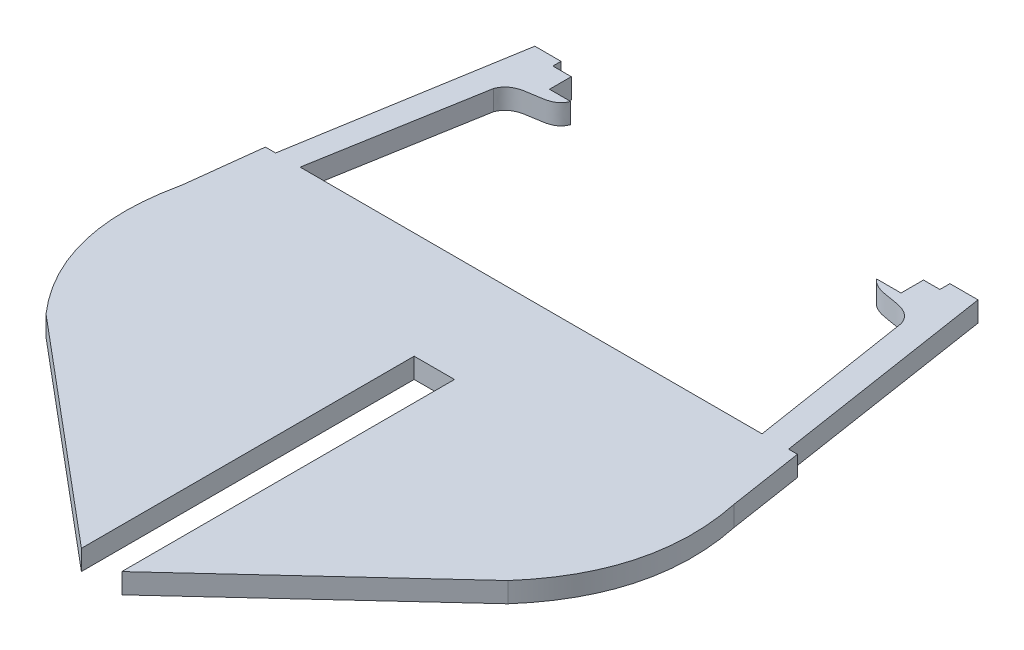
ISO-10303-21;
HEADER;
FILE_DESCRIPTION(('STEP AP214'),'2;1');
FILE_NAME('part.step','',(''),(''),'','','');
FILE_SCHEMA(('AUTOMOTIVE_DESIGN { 1 0 10303 214 1 1 1 1 }'));
ENDSEC;
DATA;
#1=APPLICATION_CONTEXT('core data for automotive mechanical design processes');
#2=APPLICATION_PROTOCOL_DEFINITION('international standard','automotive_design',2000,#1);
#3=PRODUCT_CONTEXT('',#1,'mechanical');
#4=PRODUCT('Part','Part','',(#3));
#5=PRODUCT_RELATED_PRODUCT_CATEGORY('part','',(#4));
#6=PRODUCT_DEFINITION_FORMATION('','',#4);
#7=PRODUCT_DEFINITION_CONTEXT('part definition',#1,'design');
#8=PRODUCT_DEFINITION('design','',#6,#7);
#9=PRODUCT_DEFINITION_SHAPE('','',#8);
#10=(LENGTH_UNIT() NAMED_UNIT(*) SI_UNIT(.MILLI.,.METRE.));
#11=(NAMED_UNIT(*) PLANE_ANGLE_UNIT() SI_UNIT($,.RADIAN.));
#12=(NAMED_UNIT(*) SI_UNIT($,.STERADIAN.) SOLID_ANGLE_UNIT());
#13=UNCERTAINTY_MEASURE_WITH_UNIT(LENGTH_MEASURE(1.E-05),#10,'distance_accuracy_value','');
#14=(GEOMETRIC_REPRESENTATION_CONTEXT(3) GLOBAL_UNCERTAINTY_ASSIGNED_CONTEXT((#13)) GLOBAL_UNIT_ASSIGNED_CONTEXT((#10,
#11,#12)) REPRESENTATION_CONTEXT('',''));
#15=CARTESIAN_POINT('',(0.,0.,0.));
#16=DIRECTION('',(0.,0.,1.));
#17=DIRECTION('',(1.,0.,0.));
#18=AXIS2_PLACEMENT_3D('',#15,#16,#17);
#19=CARTESIAN_POINT('',(-77.4387226913753,4.,240.131608813211));
#20=CARTESIAN_POINT('',(-63.8672811474849,4.,224.729251643021));
#21=CARTESIAN_POINT('',(-68.1138655485185,4.,204.589037384639));
#22=B_SPLINE_CURVE_WITH_KNOTS('',2,(#19,#20,#21),.UNSPECIFIED.,.F.,.F.,(3,3),(0.,1.),.UNSPECIFIED.);
#23=DIRECTION('',(0.,-1.,0.));
#24=VECTOR('',#23,1.);
#25=SURFACE_OF_LINEAR_EXTRUSION('',#22,#24);
#26=CARTESIAN_POINT('',(-77.4387226913753,0.,240.131608813211));
#27=CARTESIAN_POINT('',(-63.8672811474849,0.,224.729251643021));
#28=CARTESIAN_POINT('',(-68.1138655485185,0.,204.589037384639));
#29=B_SPLINE_CURVE_WITH_KNOTS('',2,(#26,#27,#28),.UNSPECIFIED.,.F.,.F.,(3,3),(0.,1.),.UNSPECIFIED.);
#30=CARTESIAN_POINT('',(-77.4387226913753,0.,240.131608813211));
#31=VERTEX_POINT('',#30);
#32=CARTESIAN_POINT('',(-68.1138655485185,0.,204.589037384639));
#33=VERTEX_POINT('',#32);
#34=EDGE_CURVE('E258',#31,#33,#29,.T.);
#35=ORIENTED_EDGE('',*,*,#34,.T.);
#36=DIRECTION('',(0.,-1.,0.));
#37=VECTOR('',#36,1.);
#38=CARTESIAN_POINT('',(-68.1138655485185,4.,204.589037384639));
#39=LINE('',#38,#37);
#40=CARTESIAN_POINT('',(-68.1138655485185,4.,204.589037384639));
#41=VERTEX_POINT('',#40);
#42=EDGE_CURVE('E11',#41,#33,#39,.T.);
#43=ORIENTED_EDGE('',*,*,#42,.F.);
#44=CARTESIAN_POINT('',(-77.4387226913753,4.,240.131608813211));
#45=VERTEX_POINT('',#44);
#46=EDGE_CURVE('E332',#45,#41,#22,.T.);
#47=ORIENTED_EDGE('',*,*,#46,.F.);
#48=DIRECTION('',(0.,-1.,0.));
#49=VECTOR('',#48,1.);
#50=CARTESIAN_POINT('',(-77.4387226913753,4.,240.131608813211));
#51=LINE('',#50,#49);
#52=EDGE_CURVE('E254',#45,#31,#51,.T.);
#53=ORIENTED_EDGE('',*,*,#52,.T.);
#54=EDGE_LOOP('',(#35,#43,#47,#53));
#55=FACE_BOUND('',#54,.T.);
#56=ADVANCED_FACE('F41',(#55),#25,.F.);
#57=CARTESIAN_POINT('',(-68.1138655485185,4.,204.589037384639));
#58=DIRECTION('',(-0.98826760290519,0.,0.152732265903541));
#59=DIRECTION('',(0.152732265903541,0.,0.98826760290519));
#60=AXIS2_PLACEMENT_3D('',#57,#58,#59);
#61=PLANE('',#60);
#62=DIRECTION('',(-0.152732265903541,0.,-0.98826760290519));
#63=VECTOR('',#62,1.);
#64=CARTESIAN_POINT('',(-68.1138655485185,0.,204.589037384639));
#65=LINE('',#64,#63);
#66=CARTESIAN_POINT('',(-70.4112941199473,0.,189.723323098925));
#67=VERTEX_POINT('',#66);
#68=EDGE_CURVE('E263',#33,#67,#65,.T.);
#69=ORIENTED_EDGE('',*,*,#68,.T.);
#70=DIRECTION('',(0.,-1.,0.));
#71=VECTOR('',#70,1.);
#72=CARTESIAN_POINT('',(-70.4112941199473,4.,189.723323098925));
#73=LINE('',#72,#71);
#74=CARTESIAN_POINT('',(-70.4112941199473,4.,189.723323098925));
#75=VERTEX_POINT('',#74);
#76=EDGE_CURVE('E50',#75,#67,#73,.T.);
#77=ORIENTED_EDGE('',*,*,#76,.F.);
#78=DIRECTION('',(-0.152732265903541,0.,-0.98826760290519));
#79=VECTOR('',#78,1.);
#80=CARTESIAN_POINT('',(-68.1138655485185,4.,204.589037384639));
#81=LINE('',#80,#79);
#82=EDGE_CURVE('E161',#41,#75,#81,.T.);
#83=ORIENTED_EDGE('',*,*,#82,.F.);
#84=ORIENTED_EDGE('',*,*,#42,.T.);
#85=EDGE_LOOP('',(#69,#77,#83,#84));
#86=FACE_BOUND('',#85,.T.);
#87=ADVANCED_FACE('F476',(#86),#61,.F.);
#88=CARTESIAN_POINT('',(-70.4112941199473,4.,189.723323098925));
#89=DIRECTION('',(0.,0.,1.));
#90=DIRECTION('',(1.,0.,0.));
#91=AXIS2_PLACEMENT_3D('',#88,#89,#90);
#92=PLANE('',#91);
#93=DIRECTION('',(-1.,0.,0.));
#94=VECTOR('',#93,1.);
#95=CARTESIAN_POINT('',(-70.4112941199473,0.,189.723323098925));
#96=LINE('',#95,#94);
#97=CARTESIAN_POINT('',(-72.1681512628044,0.,189.723323098925));
#98=VERTEX_POINT('',#97);
#99=EDGE_CURVE('E268',#67,#98,#96,.T.);
#100=ORIENTED_EDGE('',*,*,#99,.T.);
#101=DIRECTION('',(0.,-1.,0.));
#102=VECTOR('',#101,1.);
#103=CARTESIAN_POINT('',(-72.1681512628044,4.,189.723323098925));
#104=LINE('',#103,#102);
#105=CARTESIAN_POINT('',(-72.1681512628044,4.,189.723323098925));
#106=VERTEX_POINT('',#105);
#107=EDGE_CURVE('E399',#106,#98,#104,.T.);
#108=ORIENTED_EDGE('',*,*,#107,.F.);
#109=DIRECTION('',(-1.,0.,0.));
#110=VECTOR('',#109,1.);
#111=CARTESIAN_POINT('',(-70.4112941199473,4.,189.723323098925));
#112=LINE('',#111,#110);
#113=EDGE_CURVE('E407',#75,#106,#112,.T.);
#114=ORIENTED_EDGE('',*,*,#113,.F.);
#115=ORIENTED_EDGE('',*,*,#76,.T.);
#116=EDGE_LOOP('',(#100,#108,#114,#115));
#117=FACE_BOUND('',#116,.T.);
#118=ADVANCED_FACE('F405',(#117),#92,.F.);
#119=CARTESIAN_POINT('',(-72.1681512628044,4.,189.723323098925));
#120=DIRECTION('',(-0.98826760290519,0.,0.152732265903541));
#121=DIRECTION('',(0.152732265903541,0.,0.98826760290519));
#122=AXIS2_PLACEMENT_3D('',#119,#120,#121);
#123=PLANE('',#122);
#124=DIRECTION('',(-0.152732265903541,0.,-0.98826760290519));
#125=VECTOR('',#124,1.);
#126=CARTESIAN_POINT('',(-72.1681512628044,0.,189.723323098925));
#127=LINE('',#126,#125);
#128=CARTESIAN_POINT('',(-79.0354024418462,0.,145.288168411011));
#129=VERTEX_POINT('',#128);
#130=EDGE_CURVE('E270',#98,#129,#127,.T.);
#131=ORIENTED_EDGE('',*,*,#130,.T.);
#132=DIRECTION('',(0.,-1.,0.));
#133=VECTOR('',#132,1.);
#134=CARTESIAN_POINT('',(-79.0354024418462,4.,145.288168411011));
#135=LINE('',#134,#133);
#136=CARTESIAN_POINT('',(-79.0354024418462,4.,145.288168411011));
#137=VERTEX_POINT('',#136);
#138=EDGE_CURVE('E396',#137,#129,#135,.T.);
#139=ORIENTED_EDGE('',*,*,#138,.F.);
#140=DIRECTION('',(-0.152732265903541,0.,-0.98826760290519));
#141=VECTOR('',#140,1.);
#142=CARTESIAN_POINT('',(-72.1681512628044,4.,189.723323098925));
#143=LINE('',#142,#141);
#144=EDGE_CURVE('E425',#106,#137,#143,.T.);
#145=ORIENTED_EDGE('',*,*,#144,.F.);
#146=ORIENTED_EDGE('',*,*,#107,.T.);
#147=EDGE_LOOP('',(#131,#139,#145,#146));
#148=FACE_BOUND('',#147,.T.);
#149=ADVANCED_FACE('F416',(#148),#123,.F.);
#150=CARTESIAN_POINT('',(-79.0354024418462,4.,145.288168411011));
#151=DIRECTION('',(0.,0.,1.));
#152=DIRECTION('',(1.,0.,0.));
#153=AXIS2_PLACEMENT_3D('',#150,#151,#152);
#154=PLANE('',#153);
#155=DIRECTION('',(-1.,0.,0.));
#156=VECTOR('',#155,1.);
#157=CARTESIAN_POINT('',(-79.0354024418462,0.,145.288168411011));
#158=LINE('',#157,#156);
#159=CARTESIAN_POINT('',(-84.6012941199477,0.,145.288168411011));
#160=VERTEX_POINT('',#159);
#161=EDGE_CURVE('E272',#129,#160,#158,.T.);
#162=ORIENTED_EDGE('',*,*,#161,.T.);
#163=DIRECTION('',(0.,-1.,0.));
#164=VECTOR('',#163,1.);
#165=CARTESIAN_POINT('',(-84.6012941199477,4.,145.288168411011));
#166=LINE('',#165,#164);
#167=CARTESIAN_POINT('',(-84.6012941199477,4.,145.288168411011));
#168=VERTEX_POINT('',#167);
#169=EDGE_CURVE('E393',#168,#160,#166,.T.);
#170=ORIENTED_EDGE('',*,*,#169,.F.);
#171=DIRECTION('',(-1.,0.,0.));
#172=VECTOR('',#171,1.);
#173=CARTESIAN_POINT('',(-79.0354024418462,4.,145.288168411011));
#174=LINE('',#173,#172);
#175=EDGE_CURVE('E422',#137,#168,#174,.T.);
#176=ORIENTED_EDGE('',*,*,#175,.F.);
#177=ORIENTED_EDGE('',*,*,#138,.T.);
#178=EDGE_LOOP('',(#162,#170,#176,#177));
#179=FACE_BOUND('',#178,.T.);
#180=ADVANCED_FACE('F420',(#179),#154,.F.);
#181=CARTESIAN_POINT('',(-84.6012941199477,4.,145.288168411011));
#182=DIRECTION('',(1.,0.,0.));
#183=DIRECTION('',(0.,0.,-1.));
#184=AXIS2_PLACEMENT_3D('',#181,#182,#183);
#185=PLANE('',#184);
#186=DIRECTION('',(0.,0.,1.));
#187=VECTOR('',#186,1.);
#188=CARTESIAN_POINT('',(-84.6012941199477,0.,145.288168411011));
#189=LINE('',#188,#187);
#190=CARTESIAN_POINT('',(-84.6012941199477,0.,147.288465956068));
#191=VERTEX_POINT('',#190);
#192=EDGE_CURVE('E274',#160,#191,#189,.T.);
#193=ORIENTED_EDGE('',*,*,#192,.T.);
#194=DIRECTION('',(0.,-1.,0.));
#195=VECTOR('',#194,1.);
#196=CARTESIAN_POINT('',(-84.6012941199477,4.,147.288465956068));
#197=LINE('',#196,#195);
#198=CARTESIAN_POINT('',(-84.6012941199477,4.,147.288465956068));
#199=VERTEX_POINT('',#198);
#200=EDGE_CURVE('E390',#199,#191,#197,.T.);
#201=ORIENTED_EDGE('',*,*,#200,.F.);
#202=DIRECTION('',(0.,0.,1.));
#203=VECTOR('',#202,1.);
#204=CARTESIAN_POINT('',(-84.6012941199477,4.,145.288168411011));
#205=LINE('',#204,#203);
#206=EDGE_CURVE('E424',#168,#199,#205,.T.);
#207=ORIENTED_EDGE('',*,*,#206,.F.);
#208=ORIENTED_EDGE('',*,*,#169,.T.);
#209=EDGE_LOOP('',(#193,#201,#207,#208));
#210=FACE_BOUND('',#209,.T.);
#211=ADVANCED_FACE('F466',(#210),#185,.F.);
#212=CARTESIAN_POINT('',(-84.6012941199477,4.,147.288465956068));
#213=DIRECTION('',(0.,0.,1.));
#214=DIRECTION('',(1.,0.,0.));
#215=AXIS2_PLACEMENT_3D('',#212,#213,#214);
#216=PLANE('',#215);
#217=DIRECTION('',(-1.,0.,0.));
#218=VECTOR('',#217,1.);
#219=CARTESIAN_POINT('',(-84.6012941199477,0.,147.288465956068));
#220=LINE('',#219,#218);
#221=CARTESIAN_POINT('',(-87.8447226913763,0.,147.288465956068));
#222=VERTEX_POINT('',#221);
#223=EDGE_CURVE('E276',#191,#222,#220,.T.);
#224=ORIENTED_EDGE('',*,*,#223,.T.);
#225=DIRECTION('',(0.,-1.,0.));
#226=VECTOR('',#225,1.);
#227=CARTESIAN_POINT('',(-87.8447226913763,4.,147.288465956068));
#228=LINE('',#227,#226);
#229=CARTESIAN_POINT('',(-87.8447226913763,4.,147.288465956068));
#230=VERTEX_POINT('',#229);
#231=EDGE_CURVE('E387',#230,#222,#228,.T.);
#232=ORIENTED_EDGE('',*,*,#231,.F.);
#233=DIRECTION('',(-1.,0.,0.));
#234=VECTOR('',#233,1.);
#235=CARTESIAN_POINT('',(-84.6012941199477,4.,147.288465956068));
#236=LINE('',#235,#234);
#237=EDGE_CURVE('E427',#199,#230,#236,.T.);
#238=ORIENTED_EDGE('',*,*,#237,.F.);
#239=ORIENTED_EDGE('',*,*,#200,.T.);
#240=EDGE_LOOP('',(#224,#232,#238,#239));
#241=FACE_BOUND('',#240,.T.);
#242=ADVANCED_FACE('F462',(#241),#216,.F.);
#243=CARTESIAN_POINT('',(-87.8447226913763,4.,147.288465956068));
#244=DIRECTION('',(1.,0.,0.));
#245=DIRECTION('',(0.,0.,-1.));
#246=AXIS2_PLACEMENT_3D('',#243,#244,#245);
#247=PLANE('',#246);
#248=DIRECTION('',(0.,0.,1.));
#249=VECTOR('',#248,1.);
#250=CARTESIAN_POINT('',(-87.8447226913763,0.,147.288465956068));
#251=LINE('',#250,#249);
#252=CARTESIAN_POINT('',(-87.8447226913763,0.,151.748180241783));
#253=VERTEX_POINT('',#252);
#254=EDGE_CURVE('E278',#222,#253,#251,.T.);
#255=ORIENTED_EDGE('',*,*,#254,.T.);
#256=DIRECTION('',(0.,-1.,0.));
#257=VECTOR('',#256,1.);
#258=CARTESIAN_POINT('',(-87.8447226913763,4.,151.748180241783));
#259=LINE('',#258,#257);
#260=CARTESIAN_POINT('',(-87.8447226913763,4.,151.748180241783));
#261=VERTEX_POINT('',#260);
#262=EDGE_CURVE('E384',#261,#253,#259,.T.);
#263=ORIENTED_EDGE('',*,*,#262,.F.);
#264=DIRECTION('',(0.,0.,1.));
#265=VECTOR('',#264,1.);
#266=CARTESIAN_POINT('',(-87.8447226913763,4.,147.288465956068));
#267=LINE('',#266,#265);
#268=EDGE_CURVE('E433',#230,#261,#267,.T.);
#269=ORIENTED_EDGE('',*,*,#268,.F.);
#270=ORIENTED_EDGE('',*,*,#231,.T.);
#271=EDGE_LOOP('',(#255,#263,#269,#270));
#272=FACE_BOUND('',#271,.T.);
#273=ADVANCED_FACE('F458',(#272),#247,.F.);
#274=CARTESIAN_POINT('',(-87.8447226913763,4.,151.748180241783));
#275=DIRECTION('',(0.,0.,1.));
#276=DIRECTION('',(1.,0.,0.));
#277=AXIS2_PLACEMENT_3D('',#274,#275,#276);
#278=PLANE('',#277);
#279=DIRECTION('',(-1.,0.,0.));
#280=VECTOR('',#279,1.);
#281=CARTESIAN_POINT('',(-87.8447226913763,0.,151.748180241783));
#282=LINE('',#281,#280);
#283=CARTESIAN_POINT('',(-92.7098655485191,0.,151.748180241783));
#284=VERTEX_POINT('',#283);
#285=EDGE_CURVE('E280',#253,#284,#282,.T.);
#286=ORIENTED_EDGE('',*,*,#285,.T.);
#287=DIRECTION('',(0.,-1.,0.));
#288=VECTOR('',#287,1.);
#289=CARTESIAN_POINT('',(-92.7098655485191,4.,151.748180241783));
#290=LINE('',#289,#288);
#291=CARTESIAN_POINT('',(-92.7098655485191,4.,151.748180241783));
#292=VERTEX_POINT('',#291);
#293=EDGE_CURVE('E381',#292,#284,#290,.T.);
#294=ORIENTED_EDGE('',*,*,#293,.F.);
#295=DIRECTION('',(-1.,0.,0.));
#296=VECTOR('',#295,1.);
#297=CARTESIAN_POINT('',(-87.8447226913763,4.,151.748180241783));
#298=LINE('',#297,#296);
#299=EDGE_CURVE('E435',#261,#292,#298,.T.);
#300=ORIENTED_EDGE('',*,*,#299,.F.);
#301=ORIENTED_EDGE('',*,*,#262,.T.);
#302=EDGE_LOOP('',(#286,#294,#300,#301));
#303=FACE_BOUND('',#302,.T.);
#304=ADVANCED_FACE('F453',(#303),#278,.F.);
#305=CARTESIAN_POINT('',(-92.7098655485191,4.,151.748180241783));
#306=CARTESIAN_POINT('',(-90.0107178935867,4.,155.009209907603));
#307=CARTESIAN_POINT('',(-84.1380504824903,4.,152.326043307403));
#308=CARTESIAN_POINT('',(-82.5741512628047,4.,157.018751670354));
#309=B_SPLINE_CURVE_WITH_KNOTS('',3,(#305,#306,#307,#308),.UNSPECIFIED.,.F.,.F.,(4,4),(0.,1.),.UNSPECIFIED.);
#310=DIRECTION('',(0.,-1.,0.));
#311=VECTOR('',#310,1.);
#312=SURFACE_OF_LINEAR_EXTRUSION('',#309,#311);
#313=CARTESIAN_POINT('',(-92.7098655485191,0.,151.748180241783));
#314=CARTESIAN_POINT('',(-90.0107178935867,0.,155.009209907603));
#315=CARTESIAN_POINT('',(-84.1380504824903,0.,152.326043307403));
#316=CARTESIAN_POINT('',(-82.5741512628047,0.,157.018751670354));
#317=B_SPLINE_CURVE_WITH_KNOTS('',3,(#313,#314,#315,#316),.UNSPECIFIED.,.F.,.F.,(4,4),(0.,1.),.UNSPECIFIED.);
#318=CARTESIAN_POINT('',(-82.5741512628047,0.,157.018751670354));
#319=VERTEX_POINT('',#318);
#320=EDGE_CURVE('E282',#284,#319,#317,.T.);
#321=ORIENTED_EDGE('',*,*,#320,.T.);
#322=DIRECTION('',(0.,-1.,0.));
#323=VECTOR('',#322,1.);
#324=CARTESIAN_POINT('',(-82.5741512628047,4.,157.018751670354));
#325=LINE('',#324,#323);
#326=CARTESIAN_POINT('',(-82.5741512628047,4.,157.018751670354));
#327=VERTEX_POINT('',#326);
#328=EDGE_CURVE('E378',#327,#319,#325,.T.);
#329=ORIENTED_EDGE('',*,*,#328,.F.);
#330=EDGE_CURVE('E437',#292,#327,#309,.T.);
#331=ORIENTED_EDGE('',*,*,#330,.F.);
#332=ORIENTED_EDGE('',*,*,#293,.T.);
#333=EDGE_LOOP('',(#321,#329,#331,#332));
#334=FACE_BOUND('',#333,.T.);
#335=ADVANCED_FACE('F448',(#334),#312,.F.);
#336=CARTESIAN_POINT('',(-82.5741512628047,4.,157.018751670354));
#337=DIRECTION('',(0.987895005450693,0.,-0.155124009120368));
#338=DIRECTION('',(-0.155124009120368,0.,-0.987895005450693));
#339=AXIS2_PLACEMENT_3D('',#336,#337,#338);
#340=PLANE('',#339);
#341=DIRECTION('',(0.155124009120368,0.,0.987895005450693));
#342=VECTOR('',#341,1.);
#343=CARTESIAN_POINT('',(-82.5741512628047,0.,157.018751670354));
#344=LINE('',#343,#342);
#345=CARTESIAN_POINT('',(-77.4387226913758,0.,189.723323098925));
#346=VERTEX_POINT('',#345);
#347=EDGE_CURVE('E286',#319,#346,#344,.T.);
#348=ORIENTED_EDGE('',*,*,#347,.T.);
#349=DIRECTION('',(0.,-1.,0.));
#350=VECTOR('',#349,1.);
#351=CARTESIAN_POINT('',(-77.4387226913758,4.,189.723323098925));
#352=LINE('',#351,#350);
#353=CARTESIAN_POINT('',(-77.4387226913758,4.,189.723323098925));
#354=VERTEX_POINT('',#353);
#355=EDGE_CURVE('E375',#354,#346,#352,.T.);
#356=ORIENTED_EDGE('',*,*,#355,.F.);
#357=DIRECTION('',(0.155124009120368,0.,0.987895005450693));
#358=VECTOR('',#357,1.);
#359=CARTESIAN_POINT('',(-82.5741512628047,4.,157.018751670354));
#360=LINE('',#359,#358);
#361=EDGE_CURVE('E442',#327,#354,#360,.T.);
#362=ORIENTED_EDGE('',*,*,#361,.F.);
#363=ORIENTED_EDGE('',*,*,#328,.T.);
#364=EDGE_LOOP('',(#348,#356,#362,#363));
#365=FACE_BOUND('',#364,.T.);
#366=ADVANCED_FACE('F452',(#365),#340,.F.);
#367=CARTESIAN_POINT('',(-77.4387226913758,4.,189.723323098925));
#368=DIRECTION('',(0.,0.,1.));
#369=DIRECTION('',(1.,0.,0.));
#370=AXIS2_PLACEMENT_3D('',#367,#368,#369);
#371=PLANE('',#370);
#372=DIRECTION('',(-1.,0.,0.));
#373=VECTOR('',#372,1.);
#374=CARTESIAN_POINT('',(-77.4387226913758,0.,189.723323098925));
#375=LINE('',#374,#373);
#376=CARTESIAN_POINT('',(-169.065579834233,0.,189.723323098925));
#377=VERTEX_POINT('',#376);
#378=EDGE_CURVE('E291',#346,#377,#375,.T.);
#379=ORIENTED_EDGE('',*,*,#378,.T.);
#380=DIRECTION('',(0.,-1.,0.));
#381=VECTOR('',#380,1.);
#382=CARTESIAN_POINT('',(-169.065579834233,4.,189.723323098925));
#383=LINE('',#382,#381);
#384=CARTESIAN_POINT('',(-169.065579834233,4.,189.723323098925));
#385=VERTEX_POINT('',#384);
#386=EDGE_CURVE('E372',#385,#377,#383,.T.);
#387=ORIENTED_EDGE('',*,*,#386,.F.);
#388=DIRECTION('',(-1.,0.,0.));
#389=VECTOR('',#388,1.);
#390=CARTESIAN_POINT('',(-77.4387226913758,4.,189.723323098925));
#391=LINE('',#390,#389);
#392=EDGE_CURVE('E565',#354,#385,#391,.T.);
#393=ORIENTED_EDGE('',*,*,#392,.F.);
#394=ORIENTED_EDGE('',*,*,#355,.T.);
#395=EDGE_LOOP('',(#379,#387,#393,#394));
#396=FACE_BOUND('',#395,.T.);
#397=ADVANCED_FACE('F564',(#396),#371,.F.);
#398=CARTESIAN_POINT('',(-169.065579834233,4.,189.723323098925));
#399=DIRECTION('',(-0.985271458114083,0.,-0.170997525788385));
#400=DIRECTION('',(-0.170997525788385,0.,0.985271458114083));
#401=AXIS2_PLACEMENT_3D('',#398,#399,#400);
#402=PLANE('',#401);
#403=DIRECTION('',(0.170997525788385,0.,-0.985271458114083));
#404=VECTOR('',#403,1.);
#405=CARTESIAN_POINT('',(-169.065579834233,0.,189.723323098925));
#406=LINE('',#405,#404);
#407=CARTESIAN_POINT('',(-163.389579834233,0.,157.018751670355));
#408=VERTEX_POINT('',#407);
#409=EDGE_CURVE('E293',#377,#408,#406,.T.);
#410=ORIENTED_EDGE('',*,*,#409,.T.);
#411=DIRECTION('',(0.,-1.,0.));
#412=VECTOR('',#411,1.);
#413=CARTESIAN_POINT('',(-163.389579834233,4.,157.018751670355));
#414=LINE('',#413,#412);
#415=CARTESIAN_POINT('',(-163.389579834233,4.,157.018751670355));
#416=VERTEX_POINT('',#415);
#417=EDGE_CURVE('E369',#416,#408,#414,.T.);
#418=ORIENTED_EDGE('',*,*,#417,.F.);
#419=DIRECTION('',(0.170997525788385,0.,-0.985271458114083));
#420=VECTOR('',#419,1.);
#421=CARTESIAN_POINT('',(-169.065579834233,4.,189.723323098925));
#422=LINE('',#421,#420);
#423=EDGE_CURVE('E561',#385,#416,#422,.T.);
#424=ORIENTED_EDGE('',*,*,#423,.F.);
#425=ORIENTED_EDGE('',*,*,#386,.T.);
#426=EDGE_LOOP('',(#410,#418,#424,#425));
#427=FACE_BOUND('',#426,.T.);
#428=ADVANCED_FACE('F558',(#427),#402,.F.);
#429=CARTESIAN_POINT('',(-163.389579834233,4.,157.018751670355));
#430=CARTESIAN_POINT('',(-161.603046346319,4.,152.481116628072));
#431=CARTESIAN_POINT('',(-155.104728125345,4.,155.721980391314));
#432=CARTESIAN_POINT('',(-153.524151262805,4.,151.61303738464));
#433=B_SPLINE_CURVE_WITH_KNOTS('',3,(#429,#430,#431,#432),.UNSPECIFIED.,.F.,.F.,(4,4),(0.,1.),.UNSPECIFIED.);
#434=DIRECTION('',(0.,-1.,0.));
#435=VECTOR('',#434,1.);
#436=SURFACE_OF_LINEAR_EXTRUSION('',#433,#435);
#437=CARTESIAN_POINT('',(-163.389579834233,0.,157.018751670355));
#438=CARTESIAN_POINT('',(-161.603046346319,0.,152.481116628072));
#439=CARTESIAN_POINT('',(-155.104728125345,0.,155.721980391314));
#440=CARTESIAN_POINT('',(-153.524151262805,0.,151.61303738464));
#441=B_SPLINE_CURVE_WITH_KNOTS('',3,(#437,#438,#439,#440),.UNSPECIFIED.,.F.,.F.,(4,4),(0.,1.),.UNSPECIFIED.);
#442=CARTESIAN_POINT('',(-153.524151262805,0.,151.61303738464));
#443=VERTEX_POINT('',#442);
#444=EDGE_CURVE('E295',#408,#443,#441,.T.);
#445=ORIENTED_EDGE('',*,*,#444,.T.);
#446=DIRECTION('',(0.,-1.,0.));
#447=VECTOR('',#446,1.);
#448=CARTESIAN_POINT('',(-153.524151262805,4.,151.61303738464));
#449=LINE('',#448,#447);
#450=CARTESIAN_POINT('',(-153.524151262805,4.,151.61303738464));
#451=VERTEX_POINT('',#450);
#452=EDGE_CURVE('E366',#451,#443,#449,.T.);
#453=ORIENTED_EDGE('',*,*,#452,.F.);
#454=EDGE_CURVE('E552',#416,#451,#433,.T.);
#455=ORIENTED_EDGE('',*,*,#454,.F.);
#456=ORIENTED_EDGE('',*,*,#417,.T.);
#457=EDGE_LOOP('',(#445,#453,#455,#456));
#458=FACE_BOUND('',#457,.T.);
#459=ADVANCED_FACE('F551',(#458),#436,.F.);
#460=CARTESIAN_POINT('',(-153.524151262805,4.,151.61303738464));
#461=DIRECTION('',(0.,0.,1.));
#462=DIRECTION('',(1.,0.,0.));
#463=AXIS2_PLACEMENT_3D('',#460,#461,#462);
#464=PLANE('',#463);
#465=DIRECTION('',(-1.,0.,0.));
#466=VECTOR('',#465,1.);
#467=CARTESIAN_POINT('',(-153.524151262805,0.,151.61303738464));
#468=LINE('',#467,#466);
#469=CARTESIAN_POINT('',(-157.713579834233,0.,151.61303738464));
#470=VERTEX_POINT('',#469);
#471=EDGE_CURVE('E299',#443,#470,#468,.T.);
#472=ORIENTED_EDGE('',*,*,#471,.T.);
#473=DIRECTION('',(0.,-1.,0.));
#474=VECTOR('',#473,1.);
#475=CARTESIAN_POINT('',(-157.713579834233,4.,151.61303738464));
#476=LINE('',#475,#474);
#477=CARTESIAN_POINT('',(-157.713579834233,4.,151.61303738464));
#478=VERTEX_POINT('',#477);
#479=EDGE_CURVE('E363',#478,#470,#476,.T.);
#480=ORIENTED_EDGE('',*,*,#479,.F.);
#481=DIRECTION('',(-1.,0.,0.));
#482=VECTOR('',#481,1.);
#483=CARTESIAN_POINT('',(-153.524151262805,4.,151.61303738464));
#484=LINE('',#483,#482);
#485=EDGE_CURVE('E547',#451,#478,#484,.T.);
#486=ORIENTED_EDGE('',*,*,#485,.F.);
#487=ORIENTED_EDGE('',*,*,#452,.T.);
#488=EDGE_LOOP('',(#472,#480,#486,#487));
#489=FACE_BOUND('',#488,.T.);
#490=ADVANCED_FACE('F546',(#489),#464,.F.);
#491=CARTESIAN_POINT('',(-157.713579834233,4.,151.61303738464));
#492=DIRECTION('',(-1.,0.,0.));
#493=DIRECTION('',(0.,0.,1.));
#494=AXIS2_PLACEMENT_3D('',#491,#492,#493);
#495=PLANE('',#494);
#496=DIRECTION('',(0.,0.,-1.));
#497=VECTOR('',#496,1.);
#498=CARTESIAN_POINT('',(-157.713579834233,0.,151.61303738464));
#499=LINE('',#498,#497);
#500=CARTESIAN_POINT('',(-157.713579834233,0.,147.288465956069));
#501=VERTEX_POINT('',#500);
#502=EDGE_CURVE('E304',#470,#501,#499,.T.);
#503=ORIENTED_EDGE('',*,*,#502,.T.);
#504=DIRECTION('',(0.,-1.,0.));
#505=VECTOR('',#504,1.);
#506=CARTESIAN_POINT('',(-157.713579834233,4.,147.288465956069));
#507=LINE('',#506,#505);
#508=CARTESIAN_POINT('',(-157.713579834233,4.,147.288465956069));
#509=VERTEX_POINT('',#508);
#510=EDGE_CURVE('E360',#509,#501,#507,.T.);
#511=ORIENTED_EDGE('',*,*,#510,.F.);
#512=DIRECTION('',(0.,0.,-1.));
#513=VECTOR('',#512,1.);
#514=CARTESIAN_POINT('',(-157.713579834233,4.,151.61303738464));
#515=LINE('',#514,#513);
#516=EDGE_CURVE('E543',#478,#509,#515,.T.);
#517=ORIENTED_EDGE('',*,*,#516,.F.);
#518=ORIENTED_EDGE('',*,*,#479,.T.);
#519=EDGE_LOOP('',(#503,#511,#517,#518));
#520=FACE_BOUND('',#519,.T.);
#521=ADVANCED_FACE('F540',(#520),#495,.F.);
#522=CARTESIAN_POINT('',(-157.713579834233,4.,147.288465956069));
#523=DIRECTION('',(0.,0.,1.));
#524=DIRECTION('',(1.,0.,0.));
#525=AXIS2_PLACEMENT_3D('',#522,#523,#524);
#526=PLANE('',#525);
#527=DIRECTION('',(-1.,0.,0.));
#528=VECTOR('',#527,1.);
#529=CARTESIAN_POINT('',(-157.713579834233,0.,147.288465956069));
#530=LINE('',#529,#528);
#531=CARTESIAN_POINT('',(-161.36243697709,0.,147.288465956069));
#532=VERTEX_POINT('',#531);
#533=EDGE_CURVE('E306',#501,#532,#530,.T.);
#534=ORIENTED_EDGE('',*,*,#533,.T.);
#535=DIRECTION('',(0.,-1.,0.));
#536=VECTOR('',#535,1.);
#537=CARTESIAN_POINT('',(-161.36243697709,4.,147.288465956069));
#538=LINE('',#537,#536);
#539=CARTESIAN_POINT('',(-161.36243697709,4.,147.288465956069));
#540=VERTEX_POINT('',#539);
#541=EDGE_CURVE('E357',#540,#532,#538,.T.);
#542=ORIENTED_EDGE('',*,*,#541,.F.);
#543=DIRECTION('',(-1.,0.,0.));
#544=VECTOR('',#543,1.);
#545=CARTESIAN_POINT('',(-157.713579834233,4.,147.288465956069));
#546=LINE('',#545,#544);
#547=EDGE_CURVE('E534',#509,#540,#546,.T.);
#548=ORIENTED_EDGE('',*,*,#547,.F.);
#549=ORIENTED_EDGE('',*,*,#510,.T.);
#550=EDGE_LOOP('',(#534,#542,#548,#549));
#551=FACE_BOUND('',#550,.T.);
#552=ADVANCED_FACE('F533',(#551),#526,.F.);
#553=CARTESIAN_POINT('',(-161.36243697709,4.,147.288465956069));
#554=DIRECTION('',(-1.,0.,0.));
#555=DIRECTION('',(0.,0.,1.));
#556=AXIS2_PLACEMENT_3D('',#553,#554,#555);
#557=PLANE('',#556);
#558=DIRECTION('',(0.,0.,-1.));
#559=VECTOR('',#558,1.);
#560=CARTESIAN_POINT('',(-161.36243697709,0.,147.288465956069));
#561=LINE('',#560,#559);
#562=CARTESIAN_POINT('',(-161.36243697709,0.,145.666751670355));
#563=VERTEX_POINT('',#562);
#564=EDGE_CURVE('E308',#532,#563,#561,.T.);
#565=ORIENTED_EDGE('',*,*,#564,.T.);
#566=DIRECTION('',(0.,-1.,0.));
#567=VECTOR('',#566,1.);
#568=CARTESIAN_POINT('',(-161.36243697709,4.,145.666751670355));
#569=LINE('',#568,#567);
#570=CARTESIAN_POINT('',(-161.36243697709,4.,145.666751670355));
#571=VERTEX_POINT('',#570);
#572=EDGE_CURVE('E354',#571,#563,#569,.T.);
#573=ORIENTED_EDGE('',*,*,#572,.F.);
#574=DIRECTION('',(0.,0.,-1.));
#575=VECTOR('',#574,1.);
#576=CARTESIAN_POINT('',(-161.36243697709,4.,147.288465956069));
#577=LINE('',#576,#575);
#578=EDGE_CURVE('E529',#540,#571,#577,.T.);
#579=ORIENTED_EDGE('',*,*,#578,.F.);
#580=ORIENTED_EDGE('',*,*,#541,.T.);
#581=EDGE_LOOP('',(#565,#573,#579,#580));
#582=FACE_BOUND('',#581,.T.);
#583=ADVANCED_FACE('F528',(#582),#557,.F.);
#584=CARTESIAN_POINT('',(-161.36243697709,4.,145.666751670355));
#585=DIRECTION('',(0.,0.,1.));
#586=DIRECTION('',(1.,0.,0.));
#587=AXIS2_PLACEMENT_3D('',#584,#585,#586);
#588=PLANE('',#587);
#589=DIRECTION('',(-1.,0.,0.));
#590=VECTOR('',#589,1.);
#591=CARTESIAN_POINT('',(-161.36243697709,0.,145.666751670355));
#592=LINE('',#591,#590);
#593=CARTESIAN_POINT('',(-166.561192779022,0.,145.666751670355));
#594=VERTEX_POINT('',#593);
#595=EDGE_CURVE('E310',#563,#594,#592,.T.);
#596=ORIENTED_EDGE('',*,*,#595,.T.);
#597=DIRECTION('',(0.,-1.,0.));
#598=VECTOR('',#597,1.);
#599=CARTESIAN_POINT('',(-166.561192779022,4.,145.666751670355));
#600=LINE('',#599,#598);
#601=CARTESIAN_POINT('',(-166.561192779022,4.,145.666751670355));
#602=VERTEX_POINT('',#601);
#603=EDGE_CURVE('E351',#602,#594,#600,.T.);
#604=ORIENTED_EDGE('',*,*,#603,.F.);
#605=DIRECTION('',(-1.,0.,0.));
#606=VECTOR('',#605,1.);
#607=CARTESIAN_POINT('',(-161.36243697709,4.,145.666751670355));
#608=LINE('',#607,#606);
#609=EDGE_CURVE('E525',#571,#602,#608,.T.);
#610=ORIENTED_EDGE('',*,*,#609,.F.);
#611=ORIENTED_EDGE('',*,*,#572,.T.);
#612=EDGE_LOOP('',(#596,#604,#610,#611));
#613=FACE_BOUND('',#612,.T.);
#614=ADVANCED_FACE('F522',(#613),#588,.F.);
#615=CARTESIAN_POINT('',(-166.561192779022,4.,145.666751670355));
#616=DIRECTION('',(0.986296574750689,0.,0.164982019126506));
#617=DIRECTION('',(0.164982019126506,0.,-0.986296574750689));
#618=AXIS2_PLACEMENT_3D('',#615,#616,#617);
#619=PLANE('',#618);
#620=DIRECTION('',(-0.164982019126506,0.,0.986296574750689));
#621=VECTOR('',#620,1.);
#622=CARTESIAN_POINT('',(-166.561192779022,0.,145.666751670355));
#623=LINE('',#622,#621);
#624=CARTESIAN_POINT('',(-173.930722691376,0.,189.723323098926));
#625=VERTEX_POINT('',#624);
#626=EDGE_CURVE('E312',#594,#625,#623,.T.);
#627=ORIENTED_EDGE('',*,*,#626,.T.);
#628=DIRECTION('',(0.,-1.,0.));
#629=VECTOR('',#628,1.);
#630=CARTESIAN_POINT('',(-173.930722691376,4.,189.723323098926));
#631=LINE('',#630,#629);
#632=CARTESIAN_POINT('',(-173.930722691376,4.,189.723323098926));
#633=VERTEX_POINT('',#632);
#634=EDGE_CURVE('E348',#633,#625,#631,.T.);
#635=ORIENTED_EDGE('',*,*,#634,.F.);
#636=DIRECTION('',(-0.164982019126506,0.,0.986296574750689));
#637=VECTOR('',#636,1.);
#638=CARTESIAN_POINT('',(-166.561192779022,4.,145.666751670355));
#639=LINE('',#638,#637);
#640=EDGE_CURVE('E516',#602,#633,#639,.T.);
#641=ORIENTED_EDGE('',*,*,#640,.F.);
#642=ORIENTED_EDGE('',*,*,#603,.T.);
#643=EDGE_LOOP('',(#627,#635,#641,#642));
#644=FACE_BOUND('',#643,.T.);
#645=ADVANCED_FACE('F515',(#644),#619,.F.);
#646=CARTESIAN_POINT('',(-173.930722691376,4.,189.723323098926));
#647=DIRECTION('',(0.,0.,1.));
#648=DIRECTION('',(1.,0.,0.));
#649=AXIS2_PLACEMENT_3D('',#646,#647,#648);
#650=PLANE('',#649);
#651=DIRECTION('',(-1.,0.,0.));
#652=VECTOR('',#651,1.);
#653=CARTESIAN_POINT('',(-173.930722691376,0.,189.723323098926));
#654=LINE('',#653,#652);
#655=CARTESIAN_POINT('',(-175.957865548519,0.,189.723323098926));
#656=VERTEX_POINT('',#655);
#657=EDGE_CURVE('E314',#625,#656,#654,.T.);
#658=ORIENTED_EDGE('',*,*,#657,.T.);
#659=DIRECTION('',(0.,-1.,0.));
#660=VECTOR('',#659,1.);
#661=CARTESIAN_POINT('',(-175.957865548519,4.,189.723323098926));
#662=LINE('',#661,#660);
#663=CARTESIAN_POINT('',(-175.957865548519,4.,189.723323098926));
#664=VERTEX_POINT('',#663);
#665=EDGE_CURVE('E345',#664,#656,#662,.T.);
#666=ORIENTED_EDGE('',*,*,#665,.F.);
#667=DIRECTION('',(-1.,0.,0.));
#668=VECTOR('',#667,1.);
#669=CARTESIAN_POINT('',(-173.930722691376,4.,189.723323098926));
#670=LINE('',#669,#668);
#671=EDGE_CURVE('E511',#633,#664,#670,.T.);
#672=ORIENTED_EDGE('',*,*,#671,.F.);
#673=ORIENTED_EDGE('',*,*,#634,.T.);
#674=EDGE_LOOP('',(#658,#666,#672,#673));
#675=FACE_BOUND('',#674,.T.);
#676=ADVANCED_FACE('F510',(#675),#650,.F.);
#677=CARTESIAN_POINT('',(-175.957865548519,4.,189.723323098926));
#678=DIRECTION('',(0.993088841064404,0.,0.117365044853053));
#679=DIRECTION('',(0.117365044853053,0.,-0.993088841064404));
#680=AXIS2_PLACEMENT_3D('',#677,#678,#679);
#681=PLANE('',#680);
#682=DIRECTION('',(-0.117365044853053,0.,0.993088841064404));
#683=VECTOR('',#682,1.);
#684=CARTESIAN_POINT('',(-175.957865548519,0.,189.723323098926));
#685=LINE('',#684,#683);
#686=CARTESIAN_POINT('',(-177.714722691375,0.,204.589037384641));
#687=VERTEX_POINT('',#686);
#688=EDGE_CURVE('E316',#656,#687,#685,.T.);
#689=ORIENTED_EDGE('',*,*,#688,.T.);
#690=DIRECTION('',(0.,-1.,0.));
#691=VECTOR('',#690,1.);
#692=CARTESIAN_POINT('',(-177.714722691375,4.,204.589037384641));
#693=LINE('',#692,#691);
#694=CARTESIAN_POINT('',(-177.714722691375,4.,204.589037384641));
#695=VERTEX_POINT('',#694);
#696=EDGE_CURVE('E342',#695,#687,#693,.T.);
#697=ORIENTED_EDGE('',*,*,#696,.F.);
#698=DIRECTION('',(-0.117365044853053,0.,0.993088841064404));
#699=VECTOR('',#698,1.);
#700=CARTESIAN_POINT('',(-175.957865548519,4.,189.723323098926));
#701=LINE('',#700,#699);
#702=EDGE_CURVE('E507',#664,#695,#701,.T.);
#703=ORIENTED_EDGE('',*,*,#702,.F.);
#704=ORIENTED_EDGE('',*,*,#665,.T.);
#705=EDGE_LOOP('',(#689,#697,#703,#704));
#706=FACE_BOUND('',#705,.T.);
#707=ADVANCED_FACE('F504',(#706),#681,.F.);
#708=CARTESIAN_POINT('',(-177.714722691375,4.,204.589037384641));
#709=CARTESIAN_POINT('',(-182.218975987812,4.,224.983917638273));
#710=CARTESIAN_POINT('',(-169.065579834232,4.,240.131608813212));
#711=B_SPLINE_CURVE_WITH_KNOTS('',2,(#708,#709,#710),.UNSPECIFIED.,.F.,.F.,(3,3),(0.,1.),.UNSPECIFIED.);
#712=DIRECTION('',(0.,-1.,0.));
#713=VECTOR('',#712,1.);
#714=SURFACE_OF_LINEAR_EXTRUSION('',#711,#713);
#715=CARTESIAN_POINT('',(-177.714722691375,0.,204.589037384641));
#716=CARTESIAN_POINT('',(-182.218975987812,0.,224.983917638273));
#717=CARTESIAN_POINT('',(-169.065579834232,0.,240.131608813212));
#718=B_SPLINE_CURVE_WITH_KNOTS('',2,(#715,#716,#717),.UNSPECIFIED.,.F.,.F.,(3,3),(0.,1.),.UNSPECIFIED.);
#719=CARTESIAN_POINT('',(-169.065579834232,0.,240.131608813212));
#720=VERTEX_POINT('',#719);
#721=EDGE_CURVE('E318',#687,#720,#718,.T.);
#722=ORIENTED_EDGE('',*,*,#721,.T.);
#723=DIRECTION('',(0.,-1.,0.));
#724=VECTOR('',#723,1.);
#725=CARTESIAN_POINT('',(-169.065579834232,4.,240.131608813212));
#726=LINE('',#725,#724);
#727=CARTESIAN_POINT('',(-169.065579834232,4.,240.131608813212));
#728=VERTEX_POINT('',#727);
#729=EDGE_CURVE('E339',#728,#720,#726,.T.);
#730=ORIENTED_EDGE('',*,*,#729,.F.);
#731=EDGE_CURVE('E498',#695,#728,#711,.T.);
#732=ORIENTED_EDGE('',*,*,#731,.F.);
#733=ORIENTED_EDGE('',*,*,#696,.T.);
#734=EDGE_LOOP('',(#722,#730,#732,#733));
#735=FACE_BOUND('',#734,.T.);
#736=ADVANCED_FACE('F497',(#735),#714,.F.);
#737=CARTESIAN_POINT('',(-169.065579834232,4.,240.131608813212));
#738=DIRECTION('',(0.642970308847843,0.,-0.765891103186419));
#739=DIRECTION('',(-0.765891103186419,0.,-0.642970308847843));
#740=AXIS2_PLACEMENT_3D('',#737,#738,#739);
#741=PLANE('',#740);
#742=DIRECTION('',(0.765891103186419,0.,0.642970308847843));
#743=VECTOR('',#742,1.);
#744=CARTESIAN_POINT('',(-169.065579834232,0.,240.131608813212));
#745=LINE('',#744,#743);
#746=CARTESIAN_POINT('',(-125.279294119947,0.,276.890465956068));
#747=VERTEX_POINT('',#746);
#748=EDGE_CURVE('E322',#720,#747,#745,.T.);
#749=ORIENTED_EDGE('',*,*,#748,.T.);
#750=DIRECTION('',(0.,-1.,0.));
#751=VECTOR('',#750,1.);
#752=CARTESIAN_POINT('',(-125.279294119947,4.,276.890465956068));
#753=LINE('',#752,#751);
#754=CARTESIAN_POINT('',(-125.279294119947,4.,276.890465956068));
#755=VERTEX_POINT('',#754);
#756=EDGE_CURVE('E336',#755,#747,#753,.T.);
#757=ORIENTED_EDGE('',*,*,#756,.F.);
#758=DIRECTION('',(0.765891103186419,0.,0.642970308847843));
#759=VECTOR('',#758,1.);
#760=CARTESIAN_POINT('',(-169.065579834232,4.,240.131608813212));
#761=LINE('',#760,#759);
#762=EDGE_CURVE('E493',#728,#755,#761,.T.);
#763=ORIENTED_EDGE('',*,*,#762,.F.);
#764=ORIENTED_EDGE('',*,*,#729,.T.);
#765=EDGE_LOOP('',(#749,#757,#763,#764));
#766=FACE_BOUND('',#765,.T.);
#767=ADVANCED_FACE('F492',(#766),#741,.F.);
#768=CARTESIAN_POINT('',(-125.279294119947,4.,276.890465956068));
#769=DIRECTION('',(-1.,0.,0.));
#770=DIRECTION('',(0.,0.,1.));
#771=AXIS2_PLACEMENT_3D('',#768,#769,#770);
#772=PLANE('',#771);
#773=DIRECTION('',(0.,0.,-1.));
#774=VECTOR('',#773,1.);
#775=CARTESIAN_POINT('',(-125.279294119947,0.,276.890465956068));
#776=LINE('',#775,#774);
#777=CARTESIAN_POINT('',(-125.279294119947,0.,210.890465956068));
#778=VERTEX_POINT('',#777);
#779=EDGE_CURVE('E327',#747,#778,#776,.T.);
#780=ORIENTED_EDGE('',*,*,#779,.T.);
#781=DIRECTION('',(0.,-1.,0.));
#782=VECTOR('',#781,1.);
#783=CARTESIAN_POINT('',(-125.279294119947,4.,210.890465956068));
#784=LINE('',#783,#782);
#785=CARTESIAN_POINT('',(-125.279294119947,4.,210.890465956068));
#786=VERTEX_POINT('',#785);
#787=EDGE_CURVE('E249',#786,#778,#784,.T.);
#788=ORIENTED_EDGE('',*,*,#787,.F.);
#789=DIRECTION('',(0.,0.,-1.));
#790=VECTOR('',#789,1.);
#791=CARTESIAN_POINT('',(-125.279294119947,4.,276.890465956068));
#792=LINE('',#791,#790);
#793=EDGE_CURVE('E240',#755,#786,#792,.T.);
#794=ORIENTED_EDGE('',*,*,#793,.F.);
#795=ORIENTED_EDGE('',*,*,#756,.T.);
#796=EDGE_LOOP('',(#780,#788,#794,#795));
#797=FACE_BOUND('',#796,.T.);
#798=ADVANCED_FACE('F488',(#797),#772,.F.);
#799=CARTESIAN_POINT('',(-125.279294119947,4.,210.890465956068));
#800=DIRECTION('',(0.,0.,-1.));
#801=DIRECTION('',(-1.,0.,0.));
#802=AXIS2_PLACEMENT_3D('',#799,#800,#801);
#803=PLANE('',#802);
#804=DIRECTION('',(1.,0.,0.));
#805=VECTOR('',#804,1.);
#806=CARTESIAN_POINT('',(-125.279294119947,0.,210.890465956068));
#807=LINE('',#806,#805);
#808=CARTESIAN_POINT('',(-117.279294119947,0.,210.890465956068));
#809=VERTEX_POINT('',#808);
#810=EDGE_CURVE('E248',#778,#809,#807,.T.);
#811=ORIENTED_EDGE('',*,*,#810,.T.);
#812=DIRECTION('',(0.,-1.,0.));
#813=VECTOR('',#812,1.);
#814=CARTESIAN_POINT('',(-117.279294119947,4.,210.890465956068));
#815=LINE('',#814,#813);
#816=CARTESIAN_POINT('',(-117.279294119947,4.,210.890465956068));
#817=VERTEX_POINT('',#816);
#818=EDGE_CURVE('E245',#817,#809,#815,.T.);
#819=ORIENTED_EDGE('',*,*,#818,.F.);
#820=DIRECTION('',(1.,0.,0.));
#821=VECTOR('',#820,1.);
#822=CARTESIAN_POINT('',(-125.279294119947,4.,210.890465956068));
#823=LINE('',#822,#821);
#824=EDGE_CURVE('E234',#786,#817,#823,.T.);
#825=ORIENTED_EDGE('',*,*,#824,.F.);
#826=ORIENTED_EDGE('',*,*,#787,.T.);
#827=EDGE_LOOP('',(#811,#819,#825,#826));
#828=FACE_BOUND('',#827,.T.);
#829=ADVANCED_FACE('F246',(#828),#803,.F.);
#830=CARTESIAN_POINT('',(-117.279294119947,4.,210.890465956068));
#831=DIRECTION('',(1.,0.,0.));
#832=DIRECTION('',(0.,0.,-1.));
#833=AXIS2_PLACEMENT_3D('',#830,#831,#832);
#834=PLANE('',#833);
#835=DIRECTION('',(0.,0.,1.));
#836=VECTOR('',#835,1.);
#837=CARTESIAN_POINT('',(-117.279294119947,0.,210.890465956068));
#838=LINE('',#837,#836);
#839=CARTESIAN_POINT('',(-117.279294119947,0.,276.890465956068));
#840=VERTEX_POINT('',#839);
#841=EDGE_CURVE('E147',#809,#840,#838,.T.);
#842=ORIENTED_EDGE('',*,*,#841,.T.);
#843=DIRECTION('',(0.,-1.,0.));
#844=VECTOR('',#843,1.);
#845=CARTESIAN_POINT('',(-117.279294119947,4.,276.890465956068));
#846=LINE('',#845,#844);
#847=CARTESIAN_POINT('',(-117.279294119947,4.,276.890465956068));
#848=VERTEX_POINT('',#847);
#849=EDGE_CURVE('E250',#848,#840,#846,.T.);
#850=ORIENTED_EDGE('',*,*,#849,.F.);
#851=DIRECTION('',(0.,0.,1.));
#852=VECTOR('',#851,1.);
#853=CARTESIAN_POINT('',(-117.279294119947,4.,210.890465956068));
#854=LINE('',#853,#852);
#855=EDGE_CURVE('E238',#817,#848,#854,.T.);
#856=ORIENTED_EDGE('',*,*,#855,.F.);
#857=ORIENTED_EDGE('',*,*,#818,.T.);
#858=EDGE_LOOP('',(#842,#850,#856,#857));
#859=FACE_BOUND('',#858,.T.);
#860=ADVANCED_FACE('F252',(#859),#834,.F.);
#861=CARTESIAN_POINT('',(-117.279294119947,4.,276.890465956068));
#862=DIRECTION('',(-0.678110209018801,0.,-0.734960233226586));
#863=DIRECTION('',(-0.734960233226587,0.,0.678110209018801));
#864=AXIS2_PLACEMENT_3D('',#861,#862,#863);
#865=PLANE('',#864);
#866=DIRECTION('',(0.734960233226586,0.,-0.678110209018801));
#867=VECTOR('',#866,1.);
#868=CARTESIAN_POINT('',(-117.279294119947,0.,276.890465956068));
#869=LINE('',#868,#867);
#870=EDGE_CURVE('E153',#840,#31,#869,.T.);
#871=ORIENTED_EDGE('',*,*,#870,.T.);
#872=ORIENTED_EDGE('',*,*,#52,.F.);
#873=DIRECTION('',(0.734960233226586,0.,-0.678110209018801));
#874=VECTOR('',#873,1.);
#875=CARTESIAN_POINT('',(-117.279294119947,4.,276.890465956068));
#876=LINE('',#875,#874);
#877=EDGE_CURVE('E58',#848,#45,#876,.T.);
#878=ORIENTED_EDGE('',*,*,#877,.F.);
#879=ORIENTED_EDGE('',*,*,#849,.T.);
#880=EDGE_LOOP('',(#871,#872,#878,#879));
#881=FACE_BOUND('',#880,.T.);
#882=ADVANCED_FACE('F767',(#881),#865,.F.);
#883=CARTESIAN_POINT('',(-68.3217876337159,4.,223.544787370973));
#884=DIRECTION('',(0.,1.,0.));
#885=DIRECTION('',(0.,0.,1.));
#886=AXIS2_PLACEMENT_3D('',#883,#884,#885);
#887=PLANE('',#886);
#888=ORIENTED_EDGE('',*,*,#46,.T.);
#889=ORIENTED_EDGE('',*,*,#82,.T.);
#890=ORIENTED_EDGE('',*,*,#113,.T.);
#891=ORIENTED_EDGE('',*,*,#144,.T.);
#892=ORIENTED_EDGE('',*,*,#175,.T.);
#893=ORIENTED_EDGE('',*,*,#206,.T.);
#894=ORIENTED_EDGE('',*,*,#237,.T.);
#895=ORIENTED_EDGE('',*,*,#268,.T.);
#896=ORIENTED_EDGE('',*,*,#299,.T.);
#897=ORIENTED_EDGE('',*,*,#330,.T.);
#898=ORIENTED_EDGE('',*,*,#361,.T.);
#899=ORIENTED_EDGE('',*,*,#392,.T.);
#900=ORIENTED_EDGE('',*,*,#423,.T.);
#901=ORIENTED_EDGE('',*,*,#454,.T.);
#902=ORIENTED_EDGE('',*,*,#485,.T.);
#903=ORIENTED_EDGE('',*,*,#516,.T.);
#904=ORIENTED_EDGE('',*,*,#547,.T.);
#905=ORIENTED_EDGE('',*,*,#578,.T.);
#906=ORIENTED_EDGE('',*,*,#609,.T.);
#907=ORIENTED_EDGE('',*,*,#640,.T.);
#908=ORIENTED_EDGE('',*,*,#671,.T.);
#909=ORIENTED_EDGE('',*,*,#702,.T.);
#910=ORIENTED_EDGE('',*,*,#731,.T.);
#911=ORIENTED_EDGE('',*,*,#762,.T.);
#912=ORIENTED_EDGE('',*,*,#793,.T.);
#913=ORIENTED_EDGE('',*,*,#824,.T.);
#914=ORIENTED_EDGE('',*,*,#855,.T.);
#915=ORIENTED_EDGE('',*,*,#877,.T.);
#916=EDGE_LOOP('',(#888,#889,#890,#891,#892,#893,#894,#895,#896,#897,#898,#899,#900,#901,#902,
#903,#904,#905,#906,#907,#908,#909,#910,#911,#912,#913,#914,#915));
#917=FACE_BOUND('',#916,.T.);
#918=ADVANCED_FACE('F236',(#917),#887,.T.);
#919=CARTESIAN_POINT('',(-68.3217876337159,0.,223.544787370973));
#920=DIRECTION('',(0.,1.,0.));
#921=DIRECTION('',(0.,0.,1.));
#922=AXIS2_PLACEMENT_3D('',#919,#920,#921);
#923=PLANE('',#922);
#924=ORIENTED_EDGE('',*,*,#34,.F.);
#925=ORIENTED_EDGE('',*,*,#870,.F.);
#926=ORIENTED_EDGE('',*,*,#841,.F.);
#927=ORIENTED_EDGE('',*,*,#810,.F.);
#928=ORIENTED_EDGE('',*,*,#779,.F.);
#929=ORIENTED_EDGE('',*,*,#748,.F.);
#930=ORIENTED_EDGE('',*,*,#721,.F.);
#931=ORIENTED_EDGE('',*,*,#688,.F.);
#932=ORIENTED_EDGE('',*,*,#657,.F.);
#933=ORIENTED_EDGE('',*,*,#626,.F.);
#934=ORIENTED_EDGE('',*,*,#595,.F.);
#935=ORIENTED_EDGE('',*,*,#564,.F.);
#936=ORIENTED_EDGE('',*,*,#533,.F.);
#937=ORIENTED_EDGE('',*,*,#502,.F.);
#938=ORIENTED_EDGE('',*,*,#471,.F.);
#939=ORIENTED_EDGE('',*,*,#444,.F.);
#940=ORIENTED_EDGE('',*,*,#409,.F.);
#941=ORIENTED_EDGE('',*,*,#378,.F.);
#942=ORIENTED_EDGE('',*,*,#347,.F.);
#943=ORIENTED_EDGE('',*,*,#320,.F.);
#944=ORIENTED_EDGE('',*,*,#285,.F.);
#945=ORIENTED_EDGE('',*,*,#254,.F.);
#946=ORIENTED_EDGE('',*,*,#223,.F.);
#947=ORIENTED_EDGE('',*,*,#192,.F.);
#948=ORIENTED_EDGE('',*,*,#161,.F.);
#949=ORIENTED_EDGE('',*,*,#130,.F.);
#950=ORIENTED_EDGE('',*,*,#99,.F.);
#951=ORIENTED_EDGE('',*,*,#68,.F.);
#952=EDGE_LOOP('',(#924,#925,#926,#927,#928,#929,#930,#931,#932,#933,#934,#935,#936,#937,#938,
#939,#940,#941,#942,#943,#944,#945,#946,#947,#948,#949,#950,#951));
#953=FACE_BOUND('',#952,.T.);
#954=ADVANCED_FACE('F411',(#953),#923,.F.);
#955=CLOSED_SHELL('',(#56,#87,#118,#149,#180,#211,#242,#273,#304,#335,#366,#397,#428,#459,#490,
#521,#552,#583,#614,#645,#676,#707,#736,#767,#798,#829,#860,#882,#918,#954));
#956=MANIFOLD_SOLID_BREP('B2',#955);
#957=ADVANCED_BREP_SHAPE_REPRESENTATION('',(#18,#956),#14);
#958=SHAPE_DEFINITION_REPRESENTATION(#9,#957);
ENDSEC;
END-ISO-10303-21;
